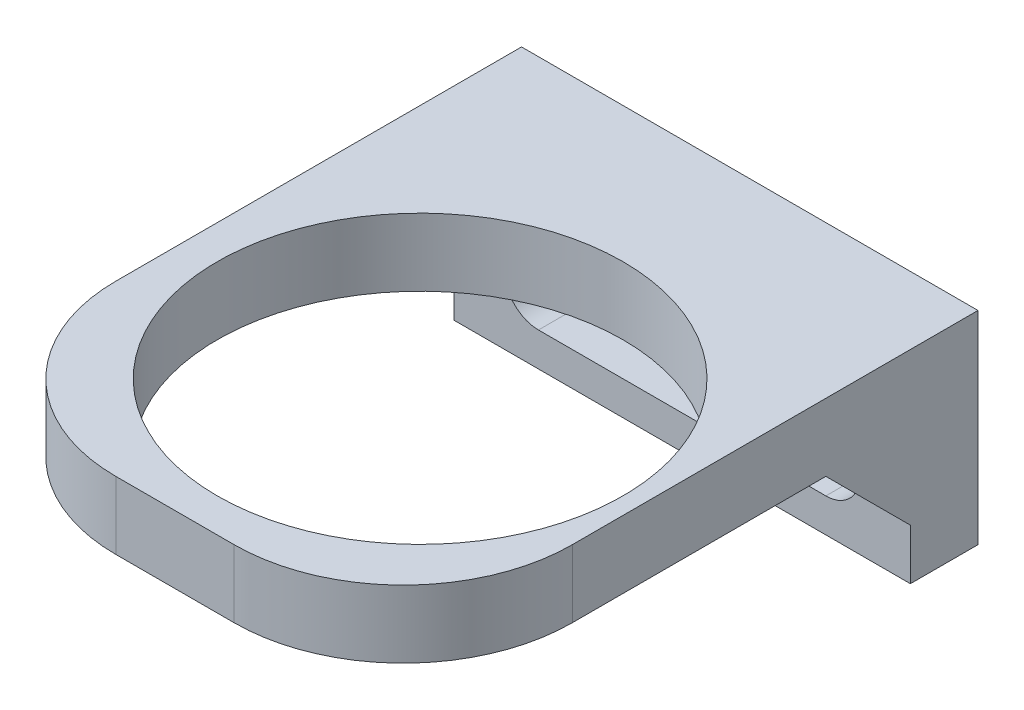
ISO-10303-21;
HEADER;
FILE_DESCRIPTION(('STEP AP214'),'2;1');
FILE_NAME('part.step','',(''),(''),'','','');
FILE_SCHEMA(('AUTOMOTIVE_DESIGN { 1 0 10303 214 1 1 1 1 }'));
ENDSEC;
DATA;
#1=APPLICATION_CONTEXT('core data for automotive mechanical design processes');
#2=APPLICATION_PROTOCOL_DEFINITION('international standard','automotive_design',2000,#1);
#3=PRODUCT_CONTEXT('',#1,'mechanical');
#4=PRODUCT('Part','Part','',(#3));
#5=PRODUCT_RELATED_PRODUCT_CATEGORY('part','',(#4));
#6=PRODUCT_DEFINITION_FORMATION('','',#4);
#7=PRODUCT_DEFINITION_CONTEXT('part definition',#1,'design');
#8=PRODUCT_DEFINITION('design','',#6,#7);
#9=PRODUCT_DEFINITION_SHAPE('','',#8);
#10=(LENGTH_UNIT() NAMED_UNIT(*) SI_UNIT(.MILLI.,.METRE.));
#11=(NAMED_UNIT(*) PLANE_ANGLE_UNIT() SI_UNIT($,.RADIAN.));
#12=(NAMED_UNIT(*) SI_UNIT($,.STERADIAN.) SOLID_ANGLE_UNIT());
#13=UNCERTAINTY_MEASURE_WITH_UNIT(LENGTH_MEASURE(1.E-05),#10,'distance_accuracy_value','');
#14=(GEOMETRIC_REPRESENTATION_CONTEXT(3) GLOBAL_UNCERTAINTY_ASSIGNED_CONTEXT((#13)) GLOBAL_UNIT_ASSIGNED_CONTEXT((#10,
#11,#12)) REPRESENTATION_CONTEXT('',''));
#15=CARTESIAN_POINT('',(0.,0.,0.));
#16=DIRECTION('',(0.,0.,1.));
#17=DIRECTION('',(1.,0.,0.));
#18=AXIS2_PLACEMENT_3D('',#15,#16,#17);
#19=CARTESIAN_POINT('',(0.,0.,0.));
#20=DIRECTION('',(0.,1.,0.));
#21=DIRECTION('',(0.,0.,1.));
#22=AXIS2_PLACEMENT_3D('',#19,#20,#21);
#23=PLANE('',#22);
#24=CARTESIAN_POINT('',(0.,0.,0.));
#25=DIRECTION('',(0.,1.,0.));
#26=DIRECTION('',(0.,0.,1.));
#27=AXIS2_PLACEMENT_3D('',#24,#25,#26);
#28=CIRCLE('',#27,12.);
#29=CARTESIAN_POINT('',(0.,0.,12.));
#30=VERTEX_POINT('',#29);
#31=EDGE_CURVE('E262',#30,#30,#28,.T.);
#32=ORIENTED_EDGE('',*,*,#31,.T.);
#33=EDGE_LOOP('',(#32));
#34=FACE_BOUND('',#33,.T.);
#35=DIRECTION('',(1.,0.,0.));
#36=VECTOR('',#35,1.);
#37=CARTESIAN_POINT('',(-14.,0.,14.));
#38=LINE('',#37,#36);
#39=CARTESIAN_POINT('',(-4.,0.,14.));
#40=VERTEX_POINT('',#39);
#41=CARTESIAN_POINT('',(3.,0.,14.));
#42=VERTEX_POINT('',#41);
#43=EDGE_CURVE('E248',#40,#42,#38,.T.);
#44=ORIENTED_EDGE('',*,*,#43,.F.);
#45=CARTESIAN_POINT('',(-4.,0.,4.));
#46=DIRECTION('',(0.,1.,0.));
#47=DIRECTION('',(0.,0.,1.));
#48=AXIS2_PLACEMENT_3D('',#45,#46,#47);
#49=CIRCLE('',#48,10.);
#50=CARTESIAN_POINT('',(-14.,0.,4.));
#51=VERTEX_POINT('',#50);
#52=EDGE_CURVE('E299',#40,#51,#49,.F.);
#53=ORIENTED_EDGE('',*,*,#52,.T.);
#54=DIRECTION('',(0.,0.,1.));
#55=VECTOR('',#54,1.);
#56=CARTESIAN_POINT('',(-14.,0.,-20.));
#57=LINE('',#56,#55);
#58=CARTESIAN_POINT('',(-14.,0.,-11.0000000000001));
#59=VERTEX_POINT('',#58);
#60=EDGE_CURVE('E234',#59,#51,#57,.T.);
#61=ORIENTED_EDGE('',*,*,#60,.F.);
#62=DIRECTION('',(-1.,0.,0.));
#63=VECTOR('',#62,1.);
#64=CARTESIAN_POINT('',(-12.,0.,-11.0000000000001));
#65=LINE('',#64,#63);
#66=CARTESIAN_POINT('',(-12.,0.,-11.0000000000001));
#67=VERTEX_POINT('',#66);
#68=EDGE_CURVE('E211',#67,#59,#65,.T.);
#69=ORIENTED_EDGE('',*,*,#68,.F.);
#70=DIRECTION('',(0.,0.,-1.));
#71=VECTOR('',#70,1.);
#72=CARTESIAN_POINT('',(-12.,0.,-11.0000000000001));
#73=LINE('',#72,#71);
#74=CARTESIAN_POINT('',(-12.,0.,-16.));
#75=VERTEX_POINT('',#74);
#76=EDGE_CURVE('E199',#67,#75,#73,.T.);
#77=ORIENTED_EDGE('',*,*,#76,.T.);
#78=DIRECTION('',(-1.,0.,0.));
#79=VECTOR('',#78,1.);
#80=CARTESIAN_POINT('',(-14.,0.,-16.));
#81=LINE('',#80,#79);
#82=CARTESIAN_POINT('',(11.,0.,-16.));
#83=VERTEX_POINT('',#82);
#84=EDGE_CURVE('E213',#83,#75,#81,.T.);
#85=ORIENTED_EDGE('',*,*,#84,.F.);
#86=DIRECTION('',(0.,0.,1.));
#87=VECTOR('',#86,1.);
#88=CARTESIAN_POINT('',(11.,0.,-16.));
#89=LINE('',#88,#87);
#90=CARTESIAN_POINT('',(11.,0.,-11.));
#91=VERTEX_POINT('',#90);
#92=EDGE_CURVE('E185',#83,#91,#89,.T.);
#93=ORIENTED_EDGE('',*,*,#92,.T.);
#94=DIRECTION('',(1.,0.,0.));
#95=VECTOR('',#94,1.);
#96=CARTESIAN_POINT('',(11.,0.,-11.));
#97=LINE('',#96,#95);
#98=CARTESIAN_POINT('',(13.,0.,-11.));
#99=VERTEX_POINT('',#98);
#100=EDGE_CURVE('E190',#91,#99,#97,.T.);
#101=ORIENTED_EDGE('',*,*,#100,.T.);
#102=DIRECTION('',(0.,0.,-1.));
#103=VECTOR('',#102,1.);
#104=CARTESIAN_POINT('',(13.,0.,-20.));
#105=LINE('',#104,#103);
#106=CARTESIAN_POINT('',(13.,0.,4.));
#107=VERTEX_POINT('',#106);
#108=EDGE_CURVE('E244',#107,#99,#105,.T.);
#109=ORIENTED_EDGE('',*,*,#108,.F.);
#110=CARTESIAN_POINT('',(3.,0.,4.));
#111=DIRECTION('',(0.,1.,0.));
#112=DIRECTION('',(0.,0.,1.));
#113=AXIS2_PLACEMENT_3D('',#110,#111,#112);
#114=CIRCLE('',#113,10.);
#115=EDGE_CURVE('E243',#107,#42,#114,.F.);
#116=ORIENTED_EDGE('',*,*,#115,.T.);
#117=EDGE_LOOP('',(#44,#53,#61,#69,#77,#85,#93,#101,#109,#116));
#118=FACE_BOUND('',#117,.T.);
#119=ADVANCED_FACE('F33',(#34,#118),#23,.F.);
#120=CARTESIAN_POINT('',(0.,4.,0.));
#121=DIRECTION('',(0.,1.,0.));
#122=DIRECTION('',(0.,0.,1.));
#123=AXIS2_PLACEMENT_3D('',#120,#121,#122);
#124=PLANE('',#123);
#125=DIRECTION('',(0.,0.,1.));
#126=VECTOR('',#125,1.);
#127=CARTESIAN_POINT('',(-14.,4.,-20.));
#128=LINE('',#127,#126);
#129=CARTESIAN_POINT('',(-14.,4.,-20.));
#130=VERTEX_POINT('',#129);
#131=CARTESIAN_POINT('',(-14.,4.,4.));
#132=VERTEX_POINT('',#131);
#133=EDGE_CURVE('E247',#130,#132,#128,.T.);
#134=ORIENTED_EDGE('',*,*,#133,.T.);
#135=CARTESIAN_POINT('',(-4.,4.,4.));
#136=DIRECTION('',(0.,1.,0.));
#137=DIRECTION('',(0.,0.,1.));
#138=AXIS2_PLACEMENT_3D('',#135,#136,#137);
#139=CIRCLE('',#138,10.);
#140=CARTESIAN_POINT('',(-4.,4.,14.));
#141=VERTEX_POINT('',#140);
#142=EDGE_CURVE('E41',#132,#141,#139,.T.);
#143=ORIENTED_EDGE('',*,*,#142,.T.);
#144=DIRECTION('',(1.,0.,0.));
#145=VECTOR('',#144,1.);
#146=CARTESIAN_POINT('',(-14.,4.,14.));
#147=LINE('',#146,#145);
#148=CARTESIAN_POINT('',(3.,4.,14.));
#149=VERTEX_POINT('',#148);
#150=EDGE_CURVE('E274',#141,#149,#147,.T.);
#151=ORIENTED_EDGE('',*,*,#150,.T.);
#152=CARTESIAN_POINT('',(3.,4.,4.));
#153=DIRECTION('',(0.,1.,0.));
#154=DIRECTION('',(0.,0.,1.));
#155=AXIS2_PLACEMENT_3D('',#152,#153,#154);
#156=CIRCLE('',#155,10.);
#157=CARTESIAN_POINT('',(13.,4.,4.));
#158=VERTEX_POINT('',#157);
#159=EDGE_CURVE('E298',#149,#158,#156,.T.);
#160=ORIENTED_EDGE('',*,*,#159,.T.);
#161=DIRECTION('',(0.,0.,-1.));
#162=VECTOR('',#161,1.);
#163=CARTESIAN_POINT('',(13.,4.,-20.));
#164=LINE('',#163,#162);
#165=CARTESIAN_POINT('',(13.,4.,-20.));
#166=VERTEX_POINT('',#165);
#167=EDGE_CURVE('E277',#158,#166,#164,.T.);
#168=ORIENTED_EDGE('',*,*,#167,.T.);
#169=DIRECTION('',(-1.,0.,0.));
#170=VECTOR('',#169,1.);
#171=CARTESIAN_POINT('',(-14.,4.,-20.));
#172=LINE('',#171,#170);
#173=EDGE_CURVE('E255',#166,#130,#172,.T.);
#174=ORIENTED_EDGE('',*,*,#173,.T.);
#175=EDGE_LOOP('',(#134,#143,#151,#160,#168,#174));
#176=FACE_BOUND('',#175,.T.);
#177=CARTESIAN_POINT('',(0.,4.,0.));
#178=DIRECTION('',(0.,1.,0.));
#179=DIRECTION('',(0.,0.,1.));
#180=AXIS2_PLACEMENT_3D('',#177,#178,#179);
#181=CIRCLE('',#180,12.);
#182=CARTESIAN_POINT('',(0.,4.,12.));
#183=VERTEX_POINT('',#182);
#184=EDGE_CURVE('E229',#183,#183,#181,.T.);
#185=ORIENTED_EDGE('',*,*,#184,.F.);
#186=EDGE_LOOP('',(#185));
#187=FACE_BOUND('',#186,.T.);
#188=ADVANCED_FACE('F283',(#176,#187),#124,.T.);
#189=CARTESIAN_POINT('',(-14.,4.,-20.));
#190=DIRECTION('',(1.,0.,0.));
#191=DIRECTION('',(0.,0.,-1.));
#192=AXIS2_PLACEMENT_3D('',#189,#190,#191);
#193=PLANE('',#192);
#194=ORIENTED_EDGE('',*,*,#60,.T.);
#195=DIRECTION('',(0.,-1.,0.));
#196=VECTOR('',#195,1.);
#197=CARTESIAN_POINT('',(-14.,4.,4.));
#198=LINE('',#197,#196);
#199=EDGE_CURVE('E295',#51,#132,#198,.F.);
#200=ORIENTED_EDGE('',*,*,#199,.T.);
#201=ORIENTED_EDGE('',*,*,#133,.F.);
#202=DIRECTION('',(0.,-1.,0.));
#203=VECTOR('',#202,1.);
#204=CARTESIAN_POINT('',(-14.,4.,-20.));
#205=LINE('',#204,#203);
#206=CARTESIAN_POINT('',(-14.,-8.,-20.));
#207=VERTEX_POINT('',#206);
#208=EDGE_CURVE('E253',#130,#207,#205,.T.);
#209=ORIENTED_EDGE('',*,*,#208,.T.);
#210=DIRECTION('',(0.,0.,-1.));
#211=VECTOR('',#210,1.);
#212=CARTESIAN_POINT('',(-14.,-8.,-20.));
#213=LINE('',#212,#211);
#214=CARTESIAN_POINT('',(-14.,-8.,-16.));
#215=VERTEX_POINT('',#214);
#216=EDGE_CURVE('E216',#215,#207,#213,.T.);
#217=ORIENTED_EDGE('',*,*,#216,.F.);
#218=DIRECTION('',(0.,1.,0.));
#219=VECTOR('',#218,1.);
#220=CARTESIAN_POINT('',(-14.,-8.,-16.));
#221=LINE('',#220,#219);
#222=CARTESIAN_POINT('',(-14.,-5.,-16.));
#223=VERTEX_POINT('',#222);
#224=EDGE_CURVE('E226',#215,#223,#221,.T.);
#225=ORIENTED_EDGE('',*,*,#224,.T.);
#226=DIRECTION('',(0.,0.707106781186551,0.707106781186544));
#227=VECTOR('',#226,1.);
#228=CARTESIAN_POINT('',(-14.,-5.,-16.));
#229=LINE('',#228,#227);
#230=EDGE_CURVE('E196',#223,#59,#229,.T.);
#231=ORIENTED_EDGE('',*,*,#230,.T.);
#232=EDGE_LOOP('',(#194,#200,#201,#209,#217,#225,#231));
#233=FACE_BOUND('',#232,.T.);
#234=ADVANCED_FACE('F293',(#233),#193,.F.);
#235=CARTESIAN_POINT('',(-14.,4.,14.));
#236=DIRECTION('',(0.,0.,-1.));
#237=DIRECTION('',(-1.,0.,0.));
#238=AXIS2_PLACEMENT_3D('',#235,#236,#237);
#239=PLANE('',#238);
#240=ORIENTED_EDGE('',*,*,#150,.F.);
#241=DIRECTION('',(0.,-1.,0.));
#242=VECTOR('',#241,1.);
#243=CARTESIAN_POINT('',(-4.,4.,14.));
#244=LINE('',#243,#242);
#245=EDGE_CURVE('E239',#141,#40,#244,.T.);
#246=ORIENTED_EDGE('',*,*,#245,.T.);
#247=ORIENTED_EDGE('',*,*,#43,.T.);
#248=DIRECTION('',(0.,-1.,0.));
#249=VECTOR('',#248,1.);
#250=CARTESIAN_POINT('',(3.,4.,14.));
#251=LINE('',#250,#249);
#252=EDGE_CURVE('E237',#42,#149,#251,.F.);
#253=ORIENTED_EDGE('',*,*,#252,.T.);
#254=EDGE_LOOP('',(#240,#246,#247,#253));
#255=FACE_BOUND('',#254,.T.);
#256=ADVANCED_FACE('F306',(#255),#239,.F.);
#257=CARTESIAN_POINT('',(13.,4.,-20.));
#258=DIRECTION('',(-1.,0.,0.));
#259=DIRECTION('',(0.,0.,1.));
#260=AXIS2_PLACEMENT_3D('',#257,#258,#259);
#261=PLANE('',#260);
#262=ORIENTED_EDGE('',*,*,#167,.F.);
#263=DIRECTION('',(0.,-1.,0.));
#264=VECTOR('',#263,1.);
#265=CARTESIAN_POINT('',(13.,4.,4.));
#266=LINE('',#265,#264);
#267=EDGE_CURVE('E11',#158,#107,#266,.T.);
#268=ORIENTED_EDGE('',*,*,#267,.T.);
#269=ORIENTED_EDGE('',*,*,#108,.T.);
#270=DIRECTION('',(0.,-0.707106781186544,-0.707106781186551));
#271=VECTOR('',#270,1.);
#272=CARTESIAN_POINT('',(13.,0.,-11.));
#273=LINE('',#272,#271);
#274=CARTESIAN_POINT('',(13.,-5.,-16.));
#275=VERTEX_POINT('',#274);
#276=EDGE_CURVE('E179',#99,#275,#273,.T.);
#277=ORIENTED_EDGE('',*,*,#276,.T.);
#278=DIRECTION('',(0.,1.,0.));
#279=VECTOR('',#278,1.);
#280=CARTESIAN_POINT('',(13.,-8.,-16.));
#281=LINE('',#280,#279);
#282=CARTESIAN_POINT('',(13.,-8.,-16.));
#283=VERTEX_POINT('',#282);
#284=EDGE_CURVE('E259',#283,#275,#281,.T.);
#285=ORIENTED_EDGE('',*,*,#284,.F.);
#286=DIRECTION('',(0.,0.,1.));
#287=VECTOR('',#286,1.);
#288=CARTESIAN_POINT('',(13.,-8.,-20.));
#289=LINE('',#288,#287);
#290=CARTESIAN_POINT('',(13.,-8.,-20.));
#291=VERTEX_POINT('',#290);
#292=EDGE_CURVE('E222',#291,#283,#289,.T.);
#293=ORIENTED_EDGE('',*,*,#292,.F.);
#294=DIRECTION('',(0.,-1.,0.));
#295=VECTOR('',#294,1.);
#296=CARTESIAN_POINT('',(13.,4.,-20.));
#297=LINE('',#296,#295);
#298=EDGE_CURVE('E240',#166,#291,#297,.T.);
#299=ORIENTED_EDGE('',*,*,#298,.F.);
#300=EDGE_LOOP('',(#262,#268,#269,#277,#285,#293,#299));
#301=FACE_BOUND('',#300,.T.);
#302=ADVANCED_FACE('F317',(#301),#261,.F.);
#303=CARTESIAN_POINT('',(-14.,4.,-20.));
#304=DIRECTION('',(0.,0.,1.));
#305=DIRECTION('',(1.,0.,0.));
#306=AXIS2_PLACEMENT_3D('',#303,#304,#305);
#307=PLANE('',#306);
#308=DIRECTION('',(-1.,0.,0.));
#309=VECTOR('',#308,1.);
#310=CARTESIAN_POINT('',(-9.,-2.,-20.));
#311=LINE('',#310,#309);
#312=CARTESIAN_POINT('',(8.,-2.,-20.));
#313=VERTEX_POINT('',#312);
#314=CARTESIAN_POINT('',(-9.,-2.,-20.));
#315=VERTEX_POINT('',#314);
#316=EDGE_CURVE('E154',#313,#315,#311,.T.);
#317=ORIENTED_EDGE('',*,*,#316,.T.);
#318=CARTESIAN_POINT('',(-9.,-4.,-20.));
#319=DIRECTION('',(0.,0.,1.));
#320=DIRECTION('',(1.,0.,0.));
#321=AXIS2_PLACEMENT_3D('',#318,#319,#320);
#322=CIRCLE('',#321,2.);
#323=CARTESIAN_POINT('',(-9.,-6.,-20.));
#324=VERTEX_POINT('',#323);
#325=EDGE_CURVE('E148',#315,#324,#322,.T.);
#326=ORIENTED_EDGE('',*,*,#325,.T.);
#327=DIRECTION('',(1.,0.,0.));
#328=VECTOR('',#327,1.);
#329=CARTESIAN_POINT('',(-9.,-6.,-20.));
#330=LINE('',#329,#328);
#331=CARTESIAN_POINT('',(8.,-6.,-20.));
#332=VERTEX_POINT('',#331);
#333=EDGE_CURVE('E157',#324,#332,#330,.T.);
#334=ORIENTED_EDGE('',*,*,#333,.T.);
#335=CARTESIAN_POINT('',(8.,-4.,-20.));
#336=DIRECTION('',(0.,0.,1.));
#337=DIRECTION('',(1.,0.,0.));
#338=AXIS2_PLACEMENT_3D('',#335,#336,#337);
#339=CIRCLE('',#338,2.);
#340=EDGE_CURVE('E48',#332,#313,#339,.T.);
#341=ORIENTED_EDGE('',*,*,#340,.T.);
#342=EDGE_LOOP('',(#317,#326,#334,#341));
#343=FACE_BOUND('',#342,.T.);
#344=ORIENTED_EDGE('',*,*,#298,.T.);
#345=DIRECTION('',(1.,0.,0.));
#346=VECTOR('',#345,1.);
#347=CARTESIAN_POINT('',(-14.,-8.,-20.));
#348=LINE('',#347,#346);
#349=EDGE_CURVE('E219',#207,#291,#348,.T.);
#350=ORIENTED_EDGE('',*,*,#349,.F.);
#351=ORIENTED_EDGE('',*,*,#208,.F.);
#352=ORIENTED_EDGE('',*,*,#173,.F.);
#353=EDGE_LOOP('',(#344,#350,#351,#352));
#354=FACE_BOUND('',#353,.T.);
#355=ADVANCED_FACE('F161',(#343,#354),#307,.F.);
#356=CARTESIAN_POINT('',(0.,4.,0.));
#357=DIRECTION('',(0.,-1.,0.));
#358=DIRECTION('',(0.,0.,-1.));
#359=AXIS2_PLACEMENT_3D('',#356,#357,#358);
#360=CYLINDRICAL_SURFACE('',#359,12.);
#361=ORIENTED_EDGE('',*,*,#184,.T.);
#362=EDGE_LOOP('',(#361));
#363=FACE_BOUND('',#362,.T.);
#364=ORIENTED_EDGE('',*,*,#31,.F.);
#365=EDGE_LOOP('',(#364));
#366=FACE_BOUND('',#365,.T.);
#367=ADVANCED_FACE('F357',(#363,#366),#360,.F.);
#368=CARTESIAN_POINT('',(-14.,-8.,-16.));
#369=DIRECTION('',(0.,0.,-1.));
#370=DIRECTION('',(-1.,0.,0.));
#371=AXIS2_PLACEMENT_3D('',#368,#369,#370);
#372=PLANE('',#371);
#373=DIRECTION('',(1.,0.,0.));
#374=VECTOR('',#373,1.);
#375=CARTESIAN_POINT('',(-9.,-6.,-16.));
#376=LINE('',#375,#374);
#377=CARTESIAN_POINT('',(-9.,-6.,-16.));
#378=VERTEX_POINT('',#377);
#379=CARTESIAN_POINT('',(8.,-6.,-16.));
#380=VERTEX_POINT('',#379);
#381=EDGE_CURVE('E173',#378,#380,#376,.T.);
#382=ORIENTED_EDGE('',*,*,#381,.F.);
#383=CARTESIAN_POINT('',(-9.,-4.,-16.));
#384=DIRECTION('',(0.,0.,1.));
#385=DIRECTION('',(1.,0.,0.));
#386=AXIS2_PLACEMENT_3D('',#383,#384,#385);
#387=CIRCLE('',#386,2.);
#388=CARTESIAN_POINT('',(-9.,-2.,-16.));
#389=VERTEX_POINT('',#388);
#390=EDGE_CURVE('E56',#389,#378,#387,.T.);
#391=ORIENTED_EDGE('',*,*,#390,.F.);
#392=DIRECTION('',(-1.,0.,0.));
#393=VECTOR('',#392,1.);
#394=CARTESIAN_POINT('',(-9.,-2.,-16.));
#395=LINE('',#394,#393);
#396=CARTESIAN_POINT('',(8.,-2.,-16.));
#397=VERTEX_POINT('',#396);
#398=EDGE_CURVE('E164',#397,#389,#395,.T.);
#399=ORIENTED_EDGE('',*,*,#398,.F.);
#400=CARTESIAN_POINT('',(8.,-4.,-16.));
#401=DIRECTION('',(0.,0.,1.));
#402=DIRECTION('',(1.,0.,0.));
#403=AXIS2_PLACEMENT_3D('',#400,#401,#402);
#404=CIRCLE('',#403,2.);
#405=EDGE_CURVE('E167',#380,#397,#404,.T.);
#406=ORIENTED_EDGE('',*,*,#405,.F.);
#407=EDGE_LOOP('',(#382,#391,#399,#406));
#408=FACE_BOUND('',#407,.T.);
#409=ORIENTED_EDGE('',*,*,#284,.T.);
#410=DIRECTION('',(1.,0.,0.));
#411=VECTOR('',#410,1.);
#412=CARTESIAN_POINT('',(11.,-5.,-16.));
#413=LINE('',#412,#411);
#414=CARTESIAN_POINT('',(11.,-5.,-16.));
#415=VERTEX_POINT('',#414);
#416=EDGE_CURVE('E193',#415,#275,#413,.T.);
#417=ORIENTED_EDGE('',*,*,#416,.F.);
#418=DIRECTION('',(0.,1.,0.));
#419=VECTOR('',#418,1.);
#420=CARTESIAN_POINT('',(11.,-5.,-16.));
#421=LINE('',#420,#419);
#422=EDGE_CURVE('E183',#415,#83,#421,.T.);
#423=ORIENTED_EDGE('',*,*,#422,.T.);
#424=ORIENTED_EDGE('',*,*,#84,.T.);
#425=DIRECTION('',(0.,-1.,0.));
#426=VECTOR('',#425,1.);
#427=CARTESIAN_POINT('',(-12.,0.,-16.));
#428=LINE('',#427,#426);
#429=CARTESIAN_POINT('',(-12.,-5.,-16.));
#430=VERTEX_POINT('',#429);
#431=EDGE_CURVE('E202',#75,#430,#428,.T.);
#432=ORIENTED_EDGE('',*,*,#431,.T.);
#433=DIRECTION('',(-1.,0.,0.));
#434=VECTOR('',#433,1.);
#435=CARTESIAN_POINT('',(-12.,-5.,-16.));
#436=LINE('',#435,#434);
#437=EDGE_CURVE('E208',#430,#223,#436,.T.);
#438=ORIENTED_EDGE('',*,*,#437,.T.);
#439=ORIENTED_EDGE('',*,*,#224,.F.);
#440=DIRECTION('',(-1.,0.,0.));
#441=VECTOR('',#440,1.);
#442=CARTESIAN_POINT('',(-14.,-8.,-16.));
#443=LINE('',#442,#441);
#444=EDGE_CURVE('E224',#283,#215,#443,.T.);
#445=ORIENTED_EDGE('',*,*,#444,.F.);
#446=EDGE_LOOP('',(#409,#417,#423,#424,#432,#438,#439,#445));
#447=FACE_BOUND('',#446,.T.);
#448=ADVANCED_FACE('F322',(#408,#447),#372,.F.);
#449=CARTESIAN_POINT('',(0.,-8.,0.));
#450=DIRECTION('',(0.,1.,0.));
#451=DIRECTION('',(0.,0.,1.));
#452=AXIS2_PLACEMENT_3D('',#449,#450,#451);
#453=PLANE('',#452);
#454=ORIENTED_EDGE('',*,*,#216,.T.);
#455=ORIENTED_EDGE('',*,*,#349,.T.);
#456=ORIENTED_EDGE('',*,*,#292,.T.);
#457=ORIENTED_EDGE('',*,*,#444,.T.);
#458=EDGE_LOOP('',(#454,#455,#456,#457));
#459=FACE_BOUND('',#458,.T.);
#460=ADVANCED_FACE('F320',(#459),#453,.F.);
#461=CARTESIAN_POINT('',(-12.,-5.,-16.));
#462=DIRECTION('',(0.,-0.707106781186544,0.707106781186551));
#463=DIRECTION('',(0.,-0.707106781186551,-0.707106781186544));
#464=AXIS2_PLACEMENT_3D('',#461,#462,#463);
#465=PLANE('',#464);
#466=ORIENTED_EDGE('',*,*,#230,.F.);
#467=ORIENTED_EDGE('',*,*,#437,.F.);
#468=DIRECTION('',(0.,0.707106781186551,0.707106781186544));
#469=VECTOR('',#468,1.);
#470=CARTESIAN_POINT('',(-12.,-5.,-16.));
#471=LINE('',#470,#469);
#472=EDGE_CURVE('E205',#430,#67,#471,.T.);
#473=ORIENTED_EDGE('',*,*,#472,.T.);
#474=ORIENTED_EDGE('',*,*,#68,.T.);
#475=EDGE_LOOP('',(#466,#467,#473,#474));
#476=FACE_BOUND('',#475,.T.);
#477=ADVANCED_FACE('F326',(#476),#465,.T.);
#478=CARTESIAN_POINT('',(-12.,0.,0.));
#479=DIRECTION('',(-1.,0.,0.));
#480=DIRECTION('',(0.,0.,1.));
#481=AXIS2_PLACEMENT_3D('',#478,#479,#480);
#482=PLANE('',#481);
#483=ORIENTED_EDGE('',*,*,#76,.F.);
#484=ORIENTED_EDGE('',*,*,#472,.F.);
#485=ORIENTED_EDGE('',*,*,#431,.F.);
#486=EDGE_LOOP('',(#483,#484,#485));
#487=FACE_BOUND('',#486,.T.);
#488=ADVANCED_FACE('F328',(#487),#482,.F.);
#489=CARTESIAN_POINT('',(11.,0.,-11.));
#490=DIRECTION('',(0.,-0.707106781186551,0.707106781186544));
#491=DIRECTION('',(0.,-0.707106781186544,-0.707106781186551));
#492=AXIS2_PLACEMENT_3D('',#489,#490,#491);
#493=PLANE('',#492);
#494=ORIENTED_EDGE('',*,*,#276,.F.);
#495=ORIENTED_EDGE('',*,*,#100,.F.);
#496=DIRECTION('',(0.,-0.707106781186544,-0.707106781186551));
#497=VECTOR('',#496,1.);
#498=CARTESIAN_POINT('',(11.,0.,-11.));
#499=LINE('',#498,#497);
#500=EDGE_CURVE('E187',#91,#415,#499,.T.);
#501=ORIENTED_EDGE('',*,*,#500,.T.);
#502=ORIENTED_EDGE('',*,*,#416,.T.);
#503=EDGE_LOOP('',(#494,#495,#501,#502));
#504=FACE_BOUND('',#503,.T.);
#505=ADVANCED_FACE('F338',(#504),#493,.T.);
#506=CARTESIAN_POINT('',(11.,0.,0.));
#507=DIRECTION('',(1.,0.,0.));
#508=DIRECTION('',(0.,0.,-1.));
#509=AXIS2_PLACEMENT_3D('',#506,#507,#508);
#510=PLANE('',#509);
#511=ORIENTED_EDGE('',*,*,#422,.F.);
#512=ORIENTED_EDGE('',*,*,#500,.F.);
#513=ORIENTED_EDGE('',*,*,#92,.F.);
#514=EDGE_LOOP('',(#511,#512,#513));
#515=FACE_BOUND('',#514,.T.);
#516=ADVANCED_FACE('F335',(#515),#510,.F.);
#517=CARTESIAN_POINT('',(-4.,4.,4.));
#518=DIRECTION('',(0.,-1.,0.));
#519=DIRECTION('',(0.,0.,-1.));
#520=AXIS2_PLACEMENT_3D('',#517,#518,#519);
#521=CYLINDRICAL_SURFACE('',#520,10.);
#522=ORIENTED_EDGE('',*,*,#142,.F.);
#523=ORIENTED_EDGE('',*,*,#199,.F.);
#524=ORIENTED_EDGE('',*,*,#52,.F.);
#525=ORIENTED_EDGE('',*,*,#245,.F.);
#526=EDGE_LOOP('',(#522,#523,#524,#525));
#527=FACE_BOUND('',#526,.T.);
#528=ADVANCED_FACE('F310',(#527),#521,.T.);
#529=CARTESIAN_POINT('',(3.,4.,4.));
#530=DIRECTION('',(0.,-1.,0.));
#531=DIRECTION('',(0.,0.,-1.));
#532=AXIS2_PLACEMENT_3D('',#529,#530,#531);
#533=CYLINDRICAL_SURFACE('',#532,10.);
#534=ORIENTED_EDGE('',*,*,#159,.F.);
#535=ORIENTED_EDGE('',*,*,#252,.F.);
#536=ORIENTED_EDGE('',*,*,#115,.F.);
#537=ORIENTED_EDGE('',*,*,#267,.F.);
#538=EDGE_LOOP('',(#534,#535,#536,#537));
#539=FACE_BOUND('',#538,.T.);
#540=ADVANCED_FACE('F35',(#539),#533,.T.);
#541=CARTESIAN_POINT('',(-9.,-4.,-20.));
#542=DIRECTION('',(0.,0.,1.));
#543=DIRECTION('',(1.,0.,0.));
#544=AXIS2_PLACEMENT_3D('',#541,#542,#543);
#545=CYLINDRICAL_SURFACE('',#544,2.);
#546=ORIENTED_EDGE('',*,*,#390,.T.);
#547=DIRECTION('',(0.,0.,1.));
#548=VECTOR('',#547,1.);
#549=CARTESIAN_POINT('',(-9.,-6.,-20.));
#550=LINE('',#549,#548);
#551=EDGE_CURVE('E144',#324,#378,#550,.T.);
#552=ORIENTED_EDGE('',*,*,#551,.F.);
#553=ORIENTED_EDGE('',*,*,#325,.F.);
#554=DIRECTION('',(0.,0.,1.));
#555=VECTOR('',#554,1.);
#556=CARTESIAN_POINT('',(-9.,-2.,-20.));
#557=LINE('',#556,#555);
#558=EDGE_CURVE('E177',#315,#389,#557,.T.);
#559=ORIENTED_EDGE('',*,*,#558,.T.);
#560=EDGE_LOOP('',(#546,#552,#553,#559));
#561=FACE_BOUND('',#560,.T.);
#562=ADVANCED_FACE('F146',(#561),#545,.F.);
#563=CARTESIAN_POINT('',(-9.,-2.,-20.));
#564=DIRECTION('',(0.,1.,0.));
#565=DIRECTION('',(0.,0.,1.));
#566=AXIS2_PLACEMENT_3D('',#563,#564,#565);
#567=PLANE('',#566);
#568=ORIENTED_EDGE('',*,*,#398,.T.);
#569=ORIENTED_EDGE('',*,*,#558,.F.);
#570=ORIENTED_EDGE('',*,*,#316,.F.);
#571=DIRECTION('',(0.,0.,1.));
#572=VECTOR('',#571,1.);
#573=CARTESIAN_POINT('',(8.,-2.,-20.));
#574=LINE('',#573,#572);
#575=EDGE_CURVE('E180',#313,#397,#574,.T.);
#576=ORIENTED_EDGE('',*,*,#575,.T.);
#577=EDGE_LOOP('',(#568,#569,#570,#576));
#578=FACE_BOUND('',#577,.T.);
#579=ADVANCED_FACE('F370',(#578),#567,.F.);
#580=CARTESIAN_POINT('',(8.,-4.,-20.));
#581=DIRECTION('',(0.,0.,1.));
#582=DIRECTION('',(1.,0.,0.));
#583=AXIS2_PLACEMENT_3D('',#580,#581,#582);
#584=CYLINDRICAL_SURFACE('',#583,2.);
#585=ORIENTED_EDGE('',*,*,#405,.T.);
#586=ORIENTED_EDGE('',*,*,#575,.F.);
#587=ORIENTED_EDGE('',*,*,#340,.F.);
#588=DIRECTION('',(0.,0.,1.));
#589=VECTOR('',#588,1.);
#590=CARTESIAN_POINT('',(8.,-6.,-20.));
#591=LINE('',#590,#589);
#592=EDGE_CURVE('E153',#332,#380,#591,.T.);
#593=ORIENTED_EDGE('',*,*,#592,.T.);
#594=EDGE_LOOP('',(#585,#586,#587,#593));
#595=FACE_BOUND('',#594,.T.);
#596=ADVANCED_FACE('F375',(#595),#584,.F.);
#597=CARTESIAN_POINT('',(-9.,-6.,-20.));
#598=DIRECTION('',(0.,-1.,0.));
#599=DIRECTION('',(0.,0.,-1.));
#600=AXIS2_PLACEMENT_3D('',#597,#598,#599);
#601=PLANE('',#600);
#602=ORIENTED_EDGE('',*,*,#381,.T.);
#603=ORIENTED_EDGE('',*,*,#592,.F.);
#604=ORIENTED_EDGE('',*,*,#333,.F.);
#605=ORIENTED_EDGE('',*,*,#551,.T.);
#606=EDGE_LOOP('',(#602,#603,#604,#605));
#607=FACE_BOUND('',#606,.T.);
#608=ADVANCED_FACE('F158',(#607),#601,.F.);
#609=CLOSED_SHELL('',(#119,#188,#234,#256,#302,#355,#367,#448,#460,#477,#488,#505,#516,#528,
#540,#562,#579,#596,#608));
#610=MANIFOLD_SOLID_BREP('B2',#609);
#611=ADVANCED_BREP_SHAPE_REPRESENTATION('',(#18,#610),#14);
#612=SHAPE_DEFINITION_REPRESENTATION(#9,#611);
ENDSEC;
END-ISO-10303-21;
